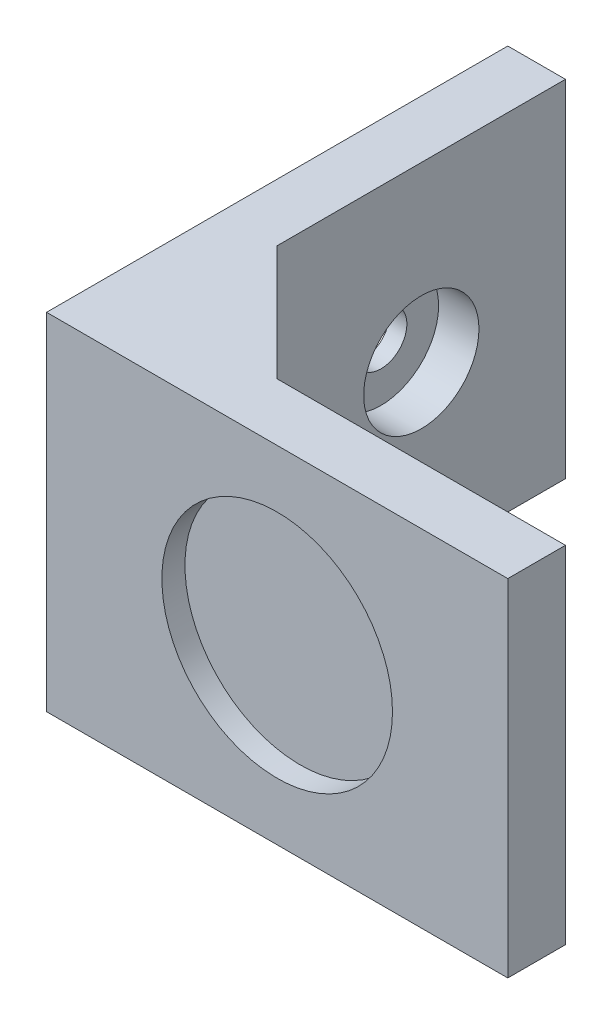
ISO-10303-21;
HEADER;
FILE_DESCRIPTION(('STEP AP214'),'2;1');
FILE_NAME('part.step','',(''),(''),'','','');
FILE_SCHEMA(('AUTOMOTIVE_DESIGN { 1 0 10303 214 1 1 1 1 }'));
ENDSEC;
DATA;
#1=APPLICATION_CONTEXT('core data for automotive mechanical design processes');
#2=APPLICATION_PROTOCOL_DEFINITION('international standard','automotive_design',2000,#1);
#3=PRODUCT_CONTEXT('',#1,'mechanical');
#4=PRODUCT('Part','Part','',(#3));
#5=PRODUCT_RELATED_PRODUCT_CATEGORY('part','',(#4));
#6=PRODUCT_DEFINITION_FORMATION('','',#4);
#7=PRODUCT_DEFINITION_CONTEXT('part definition',#1,'design');
#8=PRODUCT_DEFINITION('design','',#6,#7);
#9=PRODUCT_DEFINITION_SHAPE('','',#8);
#10=(LENGTH_UNIT() NAMED_UNIT(*) SI_UNIT(.MILLI.,.METRE.));
#11=(NAMED_UNIT(*) PLANE_ANGLE_UNIT() SI_UNIT($,.RADIAN.));
#12=(NAMED_UNIT(*) SI_UNIT($,.STERADIAN.) SOLID_ANGLE_UNIT());
#13=UNCERTAINTY_MEASURE_WITH_UNIT(LENGTH_MEASURE(1.E-05),#10,'distance_accuracy_value','');
#14=(GEOMETRIC_REPRESENTATION_CONTEXT(3) GLOBAL_UNCERTAINTY_ASSIGNED_CONTEXT((#13)) GLOBAL_UNIT_ASSIGNED_CONTEXT((#10,
#11,#12)) REPRESENTATION_CONTEXT('',''));
#15=CARTESIAN_POINT('',(0.,0.,0.));
#16=DIRECTION('',(0.,0.,1.));
#17=DIRECTION('',(1.,0.,0.));
#18=AXIS2_PLACEMENT_3D('',#15,#16,#17);
#19=CARTESIAN_POINT('',(-5.,30.,-25.));
#20=DIRECTION('',(0.,0.,1.));
#21=DIRECTION('',(1.,0.,0.));
#22=AXIS2_PLACEMENT_3D('',#19,#20,#21);
#23=PLANE('',#22);
#24=DIRECTION('',(-1.,0.,0.));
#25=VECTOR('',#24,1.);
#26=CARTESIAN_POINT('',(-5.,0.,-25.));
#27=LINE('',#26,#25);
#28=CARTESIAN_POINT('',(0.,0.,-25.));
#29=VERTEX_POINT('',#28);
#30=CARTESIAN_POINT('',(-5.,0.,-25.));
#31=VERTEX_POINT('',#30);
#32=EDGE_CURVE('E128',#29,#31,#27,.T.);
#33=ORIENTED_EDGE('',*,*,#32,.T.);
#34=DIRECTION('',(0.,-1.,0.));
#35=VECTOR('',#34,1.);
#36=CARTESIAN_POINT('',(-5.,30.,-25.));
#37=LINE('',#36,#35);
#38=CARTESIAN_POINT('',(-5.,30.,-25.));
#39=VERTEX_POINT('',#38);
#40=EDGE_CURVE('E11',#39,#31,#37,.T.);
#41=ORIENTED_EDGE('',*,*,#40,.F.);
#42=DIRECTION('',(-1.,0.,0.));
#43=VECTOR('',#42,1.);
#44=CARTESIAN_POINT('',(-5.,30.,-25.));
#45=LINE('',#44,#43);
#46=CARTESIAN_POINT('',(0.,30.,-25.));
#47=VERTEX_POINT('',#46);
#48=EDGE_CURVE('E140',#47,#39,#45,.T.);
#49=ORIENTED_EDGE('',*,*,#48,.F.);
#50=DIRECTION('',(0.,-1.,0.));
#51=VECTOR('',#50,1.);
#52=CARTESIAN_POINT('',(0.,30.,-25.));
#53=LINE('',#52,#51);
#54=EDGE_CURVE('E124',#47,#29,#53,.T.);
#55=ORIENTED_EDGE('',*,*,#54,.T.);
#56=EDGE_LOOP('',(#33,#41,#49,#55));
#57=FACE_BOUND('',#56,.T.);
#58=ADVANCED_FACE('F37',(#57),#23,.F.);
#59=CARTESIAN_POINT('',(-5.,30.,15.));
#60=DIRECTION('',(1.,0.,0.));
#61=DIRECTION('',(0.,0.,-1.));
#62=AXIS2_PLACEMENT_3D('',#59,#60,#61);
#63=PLANE('',#62);
#64=CARTESIAN_POINT('',(-5.,15.,-12.5));
#65=DIRECTION('',(1.,0.,0.));
#66=DIRECTION('',(0.,0.,-1.));
#67=AXIS2_PLACEMENT_3D('',#64,#65,#66);
#68=CIRCLE('',#67,2.25);
#69=CARTESIAN_POINT('',(-5.,15.,-14.75));
#70=VERTEX_POINT('',#69);
#71=EDGE_CURVE('E40',#70,#70,#68,.T.);
#72=ORIENTED_EDGE('',*,*,#71,.T.);
#73=EDGE_LOOP('',(#72));
#74=FACE_BOUND('',#73,.T.);
#75=DIRECTION('',(0.,0.,1.));
#76=VECTOR('',#75,1.);
#77=CARTESIAN_POINT('',(-5.,0.,15.));
#78=LINE('',#77,#76);
#79=CARTESIAN_POINT('',(-5.,0.,15.));
#80=VERTEX_POINT('',#79);
#81=EDGE_CURVE('E131',#31,#80,#78,.T.);
#82=ORIENTED_EDGE('',*,*,#81,.T.);
#83=DIRECTION('',(0.,-1.,0.));
#84=VECTOR('',#83,1.);
#85=CARTESIAN_POINT('',(-5.,30.,15.));
#86=LINE('',#85,#84);
#87=CARTESIAN_POINT('',(-5.,30.,15.));
#88=VERTEX_POINT('',#87);
#89=EDGE_CURVE('E46',#88,#80,#86,.T.);
#90=ORIENTED_EDGE('',*,*,#89,.F.);
#91=DIRECTION('',(0.,0.,1.));
#92=VECTOR('',#91,1.);
#93=CARTESIAN_POINT('',(-5.,30.,15.));
#94=LINE('',#93,#92);
#95=EDGE_CURVE('E94',#39,#88,#94,.T.);
#96=ORIENTED_EDGE('',*,*,#95,.F.);
#97=ORIENTED_EDGE('',*,*,#40,.T.);
#98=EDGE_LOOP('',(#82,#90,#96,#97));
#99=FACE_BOUND('',#98,.T.);
#100=ADVANCED_FACE('F190',(#74,#99),#63,.F.);
#101=CARTESIAN_POINT('',(35.,30.,15.));
#102=DIRECTION('',(0.,0.,-1.));
#103=DIRECTION('',(-1.,0.,0.));
#104=AXIS2_PLACEMENT_3D('',#101,#102,#103);
#105=PLANE('',#104);
#106=CARTESIAN_POINT('',(15.,15.,15.));
#107=DIRECTION('',(0.,0.,1.));
#108=DIRECTION('',(1.,0.,0.));
#109=AXIS2_PLACEMENT_3D('',#106,#107,#108);
#110=CIRCLE('',#109,10.);
#111=CARTESIAN_POINT('',(25.,15.,15.));
#112=VERTEX_POINT('',#111);
#113=EDGE_CURVE('E174',#112,#112,#110,.T.);
#114=ORIENTED_EDGE('',*,*,#113,.F.);
#115=EDGE_LOOP('',(#114));
#116=FACE_BOUND('',#115,.T.);
#117=DIRECTION('',(1.,0.,0.));
#118=VECTOR('',#117,1.);
#119=CARTESIAN_POINT('',(35.,0.,15.));
#120=LINE('',#119,#118);
#121=CARTESIAN_POINT('',(35.,0.,15.));
#122=VERTEX_POINT('',#121);
#123=EDGE_CURVE('E133',#80,#122,#120,.T.);
#124=ORIENTED_EDGE('',*,*,#123,.T.);
#125=DIRECTION('',(0.,-1.,0.));
#126=VECTOR('',#125,1.);
#127=CARTESIAN_POINT('',(35.,30.,15.));
#128=LINE('',#127,#126);
#129=CARTESIAN_POINT('',(35.,30.,15.));
#130=VERTEX_POINT('',#129);
#131=EDGE_CURVE('E144',#130,#122,#128,.T.);
#132=ORIENTED_EDGE('',*,*,#131,.F.);
#133=DIRECTION('',(1.,0.,0.));
#134=VECTOR('',#133,1.);
#135=CARTESIAN_POINT('',(35.,30.,15.));
#136=LINE('',#135,#134);
#137=EDGE_CURVE('E153',#88,#130,#136,.T.);
#138=ORIENTED_EDGE('',*,*,#137,.F.);
#139=ORIENTED_EDGE('',*,*,#89,.T.);
#140=EDGE_LOOP('',(#124,#132,#138,#139));
#141=FACE_BOUND('',#140,.T.);
#142=ADVANCED_FACE('F151',(#116,#141),#105,.F.);
#143=CARTESIAN_POINT('',(35.,30.,10.));
#144=DIRECTION('',(-1.,0.,0.));
#145=DIRECTION('',(0.,0.,1.));
#146=AXIS2_PLACEMENT_3D('',#143,#144,#145);
#147=PLANE('',#146);
#148=DIRECTION('',(0.,0.,-1.));
#149=VECTOR('',#148,1.);
#150=CARTESIAN_POINT('',(35.,0.,10.));
#151=LINE('',#150,#149);
#152=CARTESIAN_POINT('',(35.,0.,10.));
#153=VERTEX_POINT('',#152);
#154=EDGE_CURVE('E135',#122,#153,#151,.T.);
#155=ORIENTED_EDGE('',*,*,#154,.T.);
#156=DIRECTION('',(0.,-1.,0.));
#157=VECTOR('',#156,1.);
#158=CARTESIAN_POINT('',(35.,30.,10.));
#159=LINE('',#158,#157);
#160=CARTESIAN_POINT('',(35.,30.,10.));
#161=VERTEX_POINT('',#160);
#162=EDGE_CURVE('E119',#161,#153,#159,.T.);
#163=ORIENTED_EDGE('',*,*,#162,.F.);
#164=DIRECTION('',(0.,0.,-1.));
#165=VECTOR('',#164,1.);
#166=CARTESIAN_POINT('',(35.,30.,10.));
#167=LINE('',#166,#165);
#168=EDGE_CURVE('E110',#130,#161,#167,.T.);
#169=ORIENTED_EDGE('',*,*,#168,.F.);
#170=ORIENTED_EDGE('',*,*,#131,.T.);
#171=EDGE_LOOP('',(#155,#163,#169,#170));
#172=FACE_BOUND('',#171,.T.);
#173=ADVANCED_FACE('F159',(#172),#147,.F.);
#174=CARTESIAN_POINT('',(10.,30.,10.));
#175=DIRECTION('',(0.,0.,1.));
#176=DIRECTION('',(1.,0.,0.));
#177=AXIS2_PLACEMENT_3D('',#174,#175,#176);
#178=PLANE('',#177);
#179=DIRECTION('',(-1.,0.,0.));
#180=VECTOR('',#179,1.);
#181=CARTESIAN_POINT('',(10.,0.,10.));
#182=LINE('',#181,#180);
#183=CARTESIAN_POINT('',(10.,0.,10.));
#184=VERTEX_POINT('',#183);
#185=EDGE_CURVE('E118',#153,#184,#182,.T.);
#186=ORIENTED_EDGE('',*,*,#185,.T.);
#187=DIRECTION('',(0.,-1.,0.));
#188=VECTOR('',#187,1.);
#189=CARTESIAN_POINT('',(10.,30.,10.));
#190=LINE('',#189,#188);
#191=CARTESIAN_POINT('',(10.,30.,10.));
#192=VERTEX_POINT('',#191);
#193=EDGE_CURVE('E115',#192,#184,#190,.T.);
#194=ORIENTED_EDGE('',*,*,#193,.F.);
#195=DIRECTION('',(-1.,0.,0.));
#196=VECTOR('',#195,1.);
#197=CARTESIAN_POINT('',(10.,30.,10.));
#198=LINE('',#197,#196);
#199=EDGE_CURVE('E104',#161,#192,#198,.T.);
#200=ORIENTED_EDGE('',*,*,#199,.F.);
#201=ORIENTED_EDGE('',*,*,#162,.T.);
#202=EDGE_LOOP('',(#186,#194,#200,#201));
#203=FACE_BOUND('',#202,.T.);
#204=ADVANCED_FACE('F116',(#203),#178,.F.);
#205=CARTESIAN_POINT('',(0.,30.,0.));
#206=DIRECTION('',(-0.707106781186547,0.,0.707106781186548));
#207=DIRECTION('',(0.707106781186548,0.,0.707106781186547));
#208=AXIS2_PLACEMENT_3D('',#205,#206,#207);
#209=PLANE('',#208);
#210=DIRECTION('',(-0.707106781186548,0.,-0.707106781186548));
#211=VECTOR('',#210,1.);
#212=CARTESIAN_POINT('',(0.,0.,0.));
#213=LINE('',#212,#211);
#214=CARTESIAN_POINT('',(0.,0.,0.));
#215=VERTEX_POINT('',#214);
#216=EDGE_CURVE('E80',#184,#215,#213,.T.);
#217=ORIENTED_EDGE('',*,*,#216,.T.);
#218=DIRECTION('',(0.,-1.,0.));
#219=VECTOR('',#218,1.);
#220=CARTESIAN_POINT('',(0.,30.,0.));
#221=LINE('',#220,#219);
#222=CARTESIAN_POINT('',(0.,30.,0.));
#223=VERTEX_POINT('',#222);
#224=EDGE_CURVE('E120',#223,#215,#221,.T.);
#225=ORIENTED_EDGE('',*,*,#224,.F.);
#226=DIRECTION('',(-0.707106781186548,0.,-0.707106781186548));
#227=VECTOR('',#226,1.);
#228=CARTESIAN_POINT('',(0.,30.,0.));
#229=LINE('',#228,#227);
#230=EDGE_CURVE('E108',#192,#223,#229,.T.);
#231=ORIENTED_EDGE('',*,*,#230,.F.);
#232=ORIENTED_EDGE('',*,*,#193,.T.);
#233=EDGE_LOOP('',(#217,#225,#231,#232));
#234=FACE_BOUND('',#233,.T.);
#235=ADVANCED_FACE('F122',(#234),#209,.F.);
#236=CARTESIAN_POINT('',(0.,30.,-25.));
#237=DIRECTION('',(-1.,0.,0.));
#238=DIRECTION('',(0.,0.,1.));
#239=AXIS2_PLACEMENT_3D('',#236,#237,#238);
#240=PLANE('',#239);
#241=CARTESIAN_POINT('',(0.,15.,-12.5));
#242=DIRECTION('',(1.,0.,0.));
#243=DIRECTION('',(0.,0.,-1.));
#244=AXIS2_PLACEMENT_3D('',#241,#242,#243);
#245=CIRCLE('',#244,5.);
#246=CARTESIAN_POINT('',(0.,15.,-17.5));
#247=VERTEX_POINT('',#246);
#248=EDGE_CURVE('E170',#247,#247,#245,.T.);
#249=ORIENTED_EDGE('',*,*,#248,.F.);
#250=EDGE_LOOP('',(#249));
#251=FACE_BOUND('',#250,.T.);
#252=DIRECTION('',(0.,0.,-1.));
#253=VECTOR('',#252,1.);
#254=CARTESIAN_POINT('',(0.,0.,-25.));
#255=LINE('',#254,#253);
#256=EDGE_CURVE('E86',#215,#29,#255,.T.);
#257=ORIENTED_EDGE('',*,*,#256,.T.);
#258=ORIENTED_EDGE('',*,*,#54,.F.);
#259=DIRECTION('',(0.,0.,-1.));
#260=VECTOR('',#259,1.);
#261=CARTESIAN_POINT('',(0.,30.,-25.));
#262=LINE('',#261,#260);
#263=EDGE_CURVE('E54',#223,#47,#262,.T.);
#264=ORIENTED_EDGE('',*,*,#263,.F.);
#265=ORIENTED_EDGE('',*,*,#224,.T.);
#266=EDGE_LOOP('',(#257,#258,#264,#265));
#267=FACE_BOUND('',#266,.T.);
#268=ADVANCED_FACE('F204',(#251,#267),#240,.F.);
#269=CARTESIAN_POINT('',(0.,30.,0.));
#270=DIRECTION('',(0.,-1.,0.));
#271=DIRECTION('',(0.,0.,-1.));
#272=AXIS2_PLACEMENT_3D('',#269,#270,#271);
#273=PLANE('',#272);
#274=ORIENTED_EDGE('',*,*,#48,.T.);
#275=ORIENTED_EDGE('',*,*,#95,.T.);
#276=ORIENTED_EDGE('',*,*,#137,.T.);
#277=ORIENTED_EDGE('',*,*,#168,.T.);
#278=ORIENTED_EDGE('',*,*,#199,.T.);
#279=ORIENTED_EDGE('',*,*,#230,.T.);
#280=ORIENTED_EDGE('',*,*,#263,.T.);
#281=EDGE_LOOP('',(#274,#275,#276,#277,#278,#279,#280));
#282=FACE_BOUND('',#281,.T.);
#283=ADVANCED_FACE('F106',(#282),#273,.F.);
#284=CARTESIAN_POINT('',(0.,0.,0.));
#285=DIRECTION('',(0.,-1.,0.));
#286=DIRECTION('',(0.,0.,-1.));
#287=AXIS2_PLACEMENT_3D('',#284,#285,#286);
#288=PLANE('',#287);
#289=ORIENTED_EDGE('',*,*,#32,.F.);
#290=ORIENTED_EDGE('',*,*,#256,.F.);
#291=ORIENTED_EDGE('',*,*,#216,.F.);
#292=ORIENTED_EDGE('',*,*,#185,.F.);
#293=ORIENTED_EDGE('',*,*,#154,.F.);
#294=ORIENTED_EDGE('',*,*,#123,.F.);
#295=ORIENTED_EDGE('',*,*,#81,.F.);
#296=EDGE_LOOP('',(#289,#290,#291,#292,#293,#294,#295));
#297=FACE_BOUND('',#296,.T.);
#298=ADVANCED_FACE('F157',(#297),#288,.T.);
#299=CARTESIAN_POINT('',(0.,15.,-12.5));
#300=DIRECTION('',(1.,0.,0.));
#301=DIRECTION('',(0.,0.,-1.));
#302=AXIS2_PLACEMENT_3D('',#299,#300,#301);
#303=CYLINDRICAL_SURFACE('',#302,2.25);
#304=CARTESIAN_POINT('',(-3.5,15.,-12.5));
#305=DIRECTION('',(1.,0.,0.));
#306=DIRECTION('',(0.,0.,-1.));
#307=AXIS2_PLACEMENT_3D('',#304,#305,#306);
#308=CIRCLE('',#307,2.25);
#309=CARTESIAN_POINT('',(-3.5,15.,-14.75));
#310=VERTEX_POINT('',#309);
#311=EDGE_CURVE('E164',#310,#310,#308,.T.);
#312=ORIENTED_EDGE('',*,*,#311,.T.);
#313=EDGE_LOOP('',(#312));
#314=FACE_BOUND('',#313,.T.);
#315=ORIENTED_EDGE('',*,*,#71,.F.);
#316=EDGE_LOOP('',(#315));
#317=FACE_BOUND('',#316,.T.);
#318=ADVANCED_FACE('F244',(#314,#317),#303,.F.);
#319=CARTESIAN_POINT('',(-3.5,17.25,-12.5));
#320=DIRECTION('',(-1.,0.,0.));
#321=DIRECTION('',(0.,0.,1.));
#322=AXIS2_PLACEMENT_3D('',#319,#320,#321);
#323=PLANE('',#322);
#324=ORIENTED_EDGE('',*,*,#311,.F.);
#325=EDGE_LOOP('',(#324));
#326=FACE_BOUND('',#325,.T.);
#327=CARTESIAN_POINT('',(-3.5,15.,-12.5));
#328=DIRECTION('',(1.,0.,0.));
#329=DIRECTION('',(0.,0.,-1.));
#330=AXIS2_PLACEMENT_3D('',#327,#328,#329);
#331=CIRCLE('',#330,5.);
#332=CARTESIAN_POINT('',(-3.5,15.,-17.5));
#333=VERTEX_POINT('',#332);
#334=EDGE_CURVE('E167',#333,#333,#331,.T.);
#335=ORIENTED_EDGE('',*,*,#334,.T.);
#336=EDGE_LOOP('',(#335));
#337=FACE_BOUND('',#336,.T.);
#338=ADVANCED_FACE('F266',(#326,#337),#323,.F.);
#339=CARTESIAN_POINT('',(0.,15.,-12.5));
#340=DIRECTION('',(1.,0.,0.));
#341=DIRECTION('',(0.,0.,-1.));
#342=AXIS2_PLACEMENT_3D('',#339,#340,#341);
#343=CYLINDRICAL_SURFACE('',#342,5.);
#344=ORIENTED_EDGE('',*,*,#334,.F.);
#345=EDGE_LOOP('',(#344));
#346=FACE_BOUND('',#345,.T.);
#347=ORIENTED_EDGE('',*,*,#248,.T.);
#348=EDGE_LOOP('',(#347));
#349=FACE_BOUND('',#348,.T.);
#350=ADVANCED_FACE('F185',(#346,#349),#343,.F.);
#351=CARTESIAN_POINT('',(15.,15.,13.));
#352=DIRECTION('',(0.,0.,1.));
#353=DIRECTION('',(1.,0.,0.));
#354=AXIS2_PLACEMENT_3D('',#351,#352,#353);
#355=CYLINDRICAL_SURFACE('',#354,10.);
#356=CARTESIAN_POINT('',(15.,15.,13.));
#357=DIRECTION('',(0.,0.,1.));
#358=DIRECTION('',(1.,0.,0.));
#359=AXIS2_PLACEMENT_3D('',#356,#357,#358);
#360=CIRCLE('',#359,10.);
#361=CARTESIAN_POINT('',(25.,15.,13.));
#362=VERTEX_POINT('',#361);
#363=EDGE_CURVE('E173',#362,#362,#360,.T.);
#364=ORIENTED_EDGE('',*,*,#363,.F.);
#365=EDGE_LOOP('',(#364));
#366=FACE_BOUND('',#365,.T.);
#367=ORIENTED_EDGE('',*,*,#113,.T.);
#368=EDGE_LOOP('',(#367));
#369=FACE_BOUND('',#368,.T.);
#370=ADVANCED_FACE('F182',(#366,#369),#355,.F.);
#371=CARTESIAN_POINT('',(15.,15.,13.));
#372=DIRECTION('',(0.,0.,1.));
#373=DIRECTION('',(1.,0.,0.));
#374=AXIS2_PLACEMENT_3D('',#371,#372,#373);
#375=PLANE('',#374);
#376=ORIENTED_EDGE('',*,*,#363,.T.);
#377=EDGE_LOOP('',(#376));
#378=FACE_BOUND('',#377,.T.);
#379=ADVANCED_FACE('F180',(#378),#375,.T.);
#380=CLOSED_SHELL('',(#58,#100,#142,#173,#204,#235,#268,#283,#298,#318,#338,#350,#370,#379));
#381=MANIFOLD_SOLID_BREP('B2',#380);
#382=ADVANCED_BREP_SHAPE_REPRESENTATION('',(#18,#381),#14);
#383=SHAPE_DEFINITION_REPRESENTATION(#9,#382);
ENDSEC;
END-ISO-10303-21;
